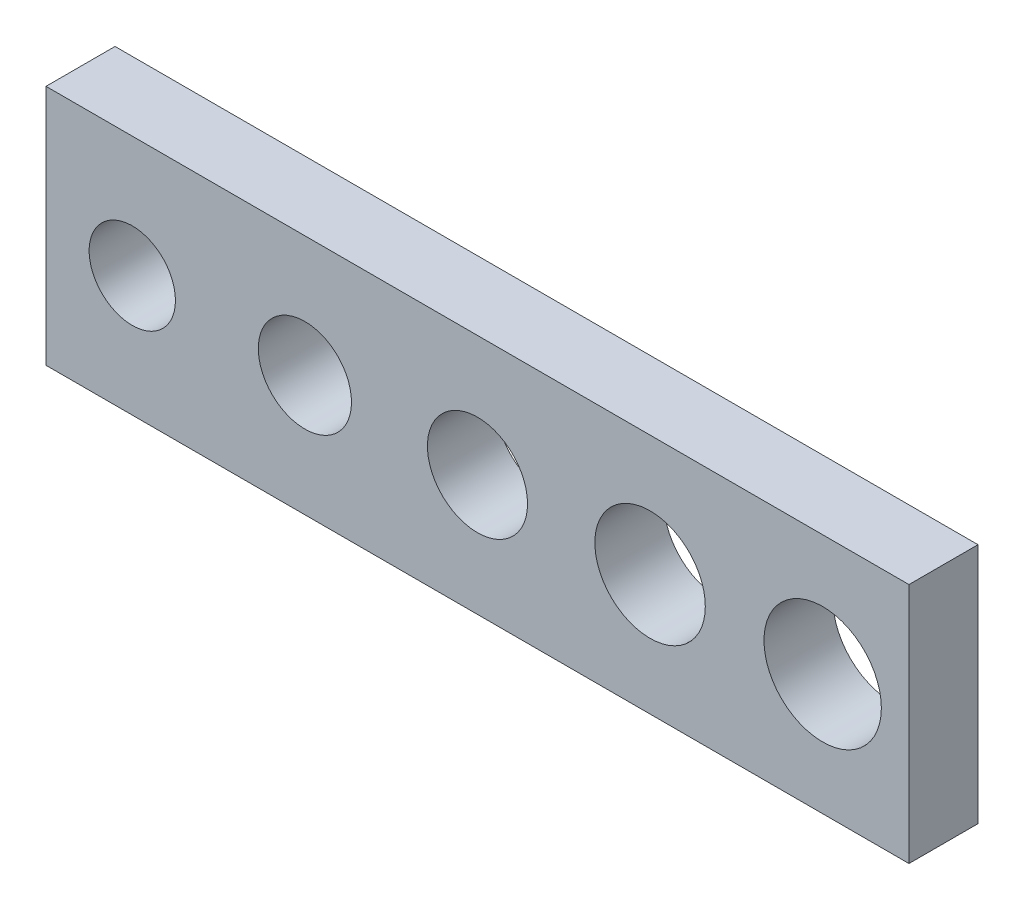
ISO-10303-21;
HEADER;
FILE_DESCRIPTION(('STEP AP214'),'2;1');
FILE_NAME('part.step','',(''),(''),'','','');
FILE_SCHEMA(('AUTOMOTIVE_DESIGN { 1 0 10303 214 1 1 1 1 }'));
ENDSEC;
DATA;
#1=APPLICATION_CONTEXT('core data for automotive mechanical design processes');
#2=APPLICATION_PROTOCOL_DEFINITION('international standard','automotive_design',2000,#1);
#3=PRODUCT_CONTEXT('',#1,'mechanical');
#4=PRODUCT('Part','Part','',(#3));
#5=PRODUCT_RELATED_PRODUCT_CATEGORY('part','',(#4));
#6=PRODUCT_DEFINITION_FORMATION('','',#4);
#7=PRODUCT_DEFINITION_CONTEXT('part definition',#1,'design');
#8=PRODUCT_DEFINITION('design','',#6,#7);
#9=PRODUCT_DEFINITION_SHAPE('','',#8);
#10=(LENGTH_UNIT() NAMED_UNIT(*) SI_UNIT(.MILLI.,.METRE.));
#11=(NAMED_UNIT(*) PLANE_ANGLE_UNIT() SI_UNIT($,.RADIAN.));
#12=(NAMED_UNIT(*) SI_UNIT($,.STERADIAN.) SOLID_ANGLE_UNIT());
#13=UNCERTAINTY_MEASURE_WITH_UNIT(LENGTH_MEASURE(1.E-05),#10,'distance_accuracy_value','');
#14=(GEOMETRIC_REPRESENTATION_CONTEXT(3) GLOBAL_UNCERTAINTY_ASSIGNED_CONTEXT((#13)) GLOBAL_UNIT_ASSIGNED_CONTEXT((#10,
#11,#12)) REPRESENTATION_CONTEXT('',''));
#15=CARTESIAN_POINT('',(0.,0.,0.));
#16=DIRECTION('',(0.,0.,1.));
#17=DIRECTION('',(1.,0.,0.));
#18=AXIS2_PLACEMENT_3D('',#15,#16,#17);
#19=CARTESIAN_POINT('',(0.,0.,5.08));
#20=DIRECTION('',(0.,0.,-1.));
#21=DIRECTION('',(-1.,0.,0.));
#22=AXIS2_PLACEMENT_3D('',#19,#20,#21);
#23=PLANE('',#22);
#24=CARTESIAN_POINT('',(44.45,8.89,5.08));
#25=DIRECTION('',(0.,0.,1.));
#26=DIRECTION('',(1.,0.,0.));
#27=AXIS2_PLACEMENT_3D('',#24,#25,#26);
#28=CIRCLE('',#27,4.06400000000002);
#29=CARTESIAN_POINT('',(48.514,8.89,5.08));
#30=VERTEX_POINT('',#29);
#31=EDGE_CURVE('E127',#30,#30,#28,.T.);
#32=ORIENTED_EDGE('',*,*,#31,.F.);
#33=EDGE_LOOP('',(#32));
#34=FACE_BOUND('',#33,.T.);
#35=CARTESIAN_POINT('',(19.05,8.89,5.08));
#36=DIRECTION('',(0.,0.,1.));
#37=DIRECTION('',(1.,0.,0.));
#38=AXIS2_PLACEMENT_3D('',#35,#36,#37);
#39=CIRCLE('',#38,3.42900000000001);
#40=CARTESIAN_POINT('',(22.479,8.89,5.08));
#41=VERTEX_POINT('',#40);
#42=EDGE_CURVE('E115',#41,#41,#39,.T.);
#43=ORIENTED_EDGE('',*,*,#42,.F.);
#44=EDGE_LOOP('',(#43));
#45=FACE_BOUND('',#44,.T.);
#46=DIRECTION('',(0.,-1.,0.));
#47=VECTOR('',#46,1.);
#48=CARTESIAN_POINT('',(0.,0.,5.08));
#49=LINE('',#48,#47);
#50=CARTESIAN_POINT('',(0.,17.78,5.08));
#51=VERTEX_POINT('',#50);
#52=CARTESIAN_POINT('',(0.,0.,5.08));
#53=VERTEX_POINT('',#52);
#54=EDGE_CURVE('E85',#51,#53,#49,.T.);
#55=ORIENTED_EDGE('',*,*,#54,.T.);
#56=DIRECTION('',(1.,0.,0.));
#57=VECTOR('',#56,1.);
#58=CARTESIAN_POINT('',(0.,0.,5.08));
#59=LINE('',#58,#57);
#60=CARTESIAN_POINT('',(63.5,0.,5.08));
#61=VERTEX_POINT('',#60);
#62=EDGE_CURVE('E80',#53,#61,#59,.T.);
#63=ORIENTED_EDGE('',*,*,#62,.T.);
#64=DIRECTION('',(0.,1.,0.));
#65=VECTOR('',#64,1.);
#66=CARTESIAN_POINT('',(63.5,0.,5.08));
#67=LINE('',#66,#65);
#68=CARTESIAN_POINT('',(63.5,17.78,5.08));
#69=VERTEX_POINT('',#68);
#70=EDGE_CURVE('E83',#61,#69,#67,.T.);
#71=ORIENTED_EDGE('',*,*,#70,.T.);
#72=DIRECTION('',(-1.,0.,0.));
#73=VECTOR('',#72,1.);
#74=CARTESIAN_POINT('',(0.,17.78,5.08));
#75=LINE('',#74,#73);
#76=EDGE_CURVE('E50',#69,#51,#75,.T.);
#77=ORIENTED_EDGE('',*,*,#76,.T.);
#78=EDGE_LOOP('',(#55,#63,#71,#77));
#79=FACE_BOUND('',#78,.T.);
#80=CARTESIAN_POINT('',(6.35,8.89,5.08));
#81=DIRECTION('',(0.,0.,1.));
#82=DIRECTION('',(1.,0.,0.));
#83=AXIS2_PLACEMENT_3D('',#80,#81,#82);
#84=CIRCLE('',#83,3.175);
#85=CARTESIAN_POINT('',(9.525,8.89,5.08));
#86=VERTEX_POINT('',#85);
#87=EDGE_CURVE('E100',#86,#86,#84,.T.);
#88=ORIENTED_EDGE('',*,*,#87,.F.);
#89=EDGE_LOOP('',(#88));
#90=FACE_BOUND('',#89,.T.);
#91=CARTESIAN_POINT('',(31.75,8.89,5.08));
#92=DIRECTION('',(0.,0.,1.));
#93=DIRECTION('',(1.,0.,0.));
#94=AXIS2_PLACEMENT_3D('',#91,#92,#93);
#95=CIRCLE('',#94,3.683);
#96=CARTESIAN_POINT('',(35.433,8.89,5.08));
#97=VERTEX_POINT('',#96);
#98=EDGE_CURVE('E121',#97,#97,#95,.T.);
#99=ORIENTED_EDGE('',*,*,#98,.F.);
#100=EDGE_LOOP('',(#99));
#101=FACE_BOUND('',#100,.T.);
#102=CARTESIAN_POINT('',(57.15,8.89,5.08));
#103=DIRECTION('',(0.,0.,1.));
#104=DIRECTION('',(1.,0.,0.));
#105=AXIS2_PLACEMENT_3D('',#102,#103,#104);
#106=CIRCLE('',#105,4.318);
#107=CARTESIAN_POINT('',(61.468,8.89,5.08));
#108=VERTEX_POINT('',#107);
#109=EDGE_CURVE('E133',#108,#108,#106,.T.);
#110=ORIENTED_EDGE('',*,*,#109,.F.);
#111=EDGE_LOOP('',(#110));
#112=FACE_BOUND('',#111,.T.);
#113=ADVANCED_FACE('F33',(#34,#45,#79,#90,#101,#112),#23,.F.);
#114=CARTESIAN_POINT('',(0.,0.,0.));
#115=DIRECTION('',(0.,0.,-1.));
#116=DIRECTION('',(-1.,0.,0.));
#117=AXIS2_PLACEMENT_3D('',#114,#115,#116);
#118=PLANE('',#117);
#119=CARTESIAN_POINT('',(44.45,8.89,0.));
#120=DIRECTION('',(0.,0.,1.));
#121=DIRECTION('',(1.,0.,0.));
#122=AXIS2_PLACEMENT_3D('',#119,#120,#121);
#123=CIRCLE('',#122,4.06400000000002);
#124=CARTESIAN_POINT('',(48.514,8.89,0.));
#125=VERTEX_POINT('',#124);
#126=EDGE_CURVE('E130',#125,#125,#123,.T.);
#127=ORIENTED_EDGE('',*,*,#126,.T.);
#128=EDGE_LOOP('',(#127));
#129=FACE_BOUND('',#128,.T.);
#130=CARTESIAN_POINT('',(19.05,8.89,0.));
#131=DIRECTION('',(0.,0.,1.));
#132=DIRECTION('',(1.,0.,0.));
#133=AXIS2_PLACEMENT_3D('',#130,#131,#132);
#134=CIRCLE('',#133,3.42900000000001);
#135=CARTESIAN_POINT('',(22.479,8.89,0.));
#136=VERTEX_POINT('',#135);
#137=EDGE_CURVE('E118',#136,#136,#134,.T.);
#138=ORIENTED_EDGE('',*,*,#137,.T.);
#139=EDGE_LOOP('',(#138));
#140=FACE_BOUND('',#139,.T.);
#141=DIRECTION('',(0.,-1.,0.));
#142=VECTOR('',#141,1.);
#143=CARTESIAN_POINT('',(0.,0.,0.));
#144=LINE('',#143,#142);
#145=CARTESIAN_POINT('',(0.,17.78,0.));
#146=VERTEX_POINT('',#145);
#147=CARTESIAN_POINT('',(0.,0.,0.));
#148=VERTEX_POINT('',#147);
#149=EDGE_CURVE('E97',#146,#148,#144,.T.);
#150=ORIENTED_EDGE('',*,*,#149,.F.);
#151=DIRECTION('',(-1.,0.,0.));
#152=VECTOR('',#151,1.);
#153=CARTESIAN_POINT('',(0.,17.78,0.));
#154=LINE('',#153,#152);
#155=CARTESIAN_POINT('',(63.5,17.78,0.));
#156=VERTEX_POINT('',#155);
#157=EDGE_CURVE('E73',#156,#146,#154,.T.);
#158=ORIENTED_EDGE('',*,*,#157,.F.);
#159=DIRECTION('',(0.,1.,0.));
#160=VECTOR('',#159,1.);
#161=CARTESIAN_POINT('',(63.5,0.,0.));
#162=LINE('',#161,#160);
#163=CARTESIAN_POINT('',(63.5,0.,0.));
#164=VERTEX_POINT('',#163);
#165=EDGE_CURVE('E67',#164,#156,#162,.T.);
#166=ORIENTED_EDGE('',*,*,#165,.F.);
#167=DIRECTION('',(1.,0.,0.));
#168=VECTOR('',#167,1.);
#169=CARTESIAN_POINT('',(0.,0.,0.));
#170=LINE('',#169,#168);
#171=EDGE_CURVE('E89',#148,#164,#170,.T.);
#172=ORIENTED_EDGE('',*,*,#171,.F.);
#173=EDGE_LOOP('',(#150,#158,#166,#172));
#174=FACE_BOUND('',#173,.T.);
#175=CARTESIAN_POINT('',(6.35,8.89,0.));
#176=DIRECTION('',(0.,0.,1.));
#177=DIRECTION('',(1.,0.,0.));
#178=AXIS2_PLACEMENT_3D('',#175,#176,#177);
#179=CIRCLE('',#178,3.175);
#180=CARTESIAN_POINT('',(9.525,8.89,0.));
#181=VERTEX_POINT('',#180);
#182=EDGE_CURVE('E112',#181,#181,#179,.T.);
#183=ORIENTED_EDGE('',*,*,#182,.T.);
#184=EDGE_LOOP('',(#183));
#185=FACE_BOUND('',#184,.T.);
#186=CARTESIAN_POINT('',(31.75,8.89,0.));
#187=DIRECTION('',(0.,0.,1.));
#188=DIRECTION('',(1.,0.,0.));
#189=AXIS2_PLACEMENT_3D('',#186,#187,#188);
#190=CIRCLE('',#189,3.683);
#191=CARTESIAN_POINT('',(35.433,8.89,0.));
#192=VERTEX_POINT('',#191);
#193=EDGE_CURVE('E124',#192,#192,#190,.T.);
#194=ORIENTED_EDGE('',*,*,#193,.T.);
#195=EDGE_LOOP('',(#194));
#196=FACE_BOUND('',#195,.T.);
#197=CARTESIAN_POINT('',(57.15,8.89,0.));
#198=DIRECTION('',(0.,0.,1.));
#199=DIRECTION('',(1.,0.,0.));
#200=AXIS2_PLACEMENT_3D('',#197,#198,#199);
#201=CIRCLE('',#200,4.318);
#202=CARTESIAN_POINT('',(61.468,8.89,0.));
#203=VERTEX_POINT('',#202);
#204=EDGE_CURVE('E136',#203,#203,#201,.T.);
#205=ORIENTED_EDGE('',*,*,#204,.T.);
#206=EDGE_LOOP('',(#205));
#207=FACE_BOUND('',#206,.T.);
#208=ADVANCED_FACE('F108',(#129,#140,#174,#185,#196,#207),#118,.T.);
#209=CARTESIAN_POINT('',(0.,0.,5.08));
#210=DIRECTION('',(1.,0.,0.));
#211=DIRECTION('',(0.,1.,0.));
#212=AXIS2_PLACEMENT_3D('',#209,#210,#211);
#213=PLANE('',#212);
#214=ORIENTED_EDGE('',*,*,#149,.T.);
#215=DIRECTION('',(0.,0.,-1.));
#216=VECTOR('',#215,1.);
#217=CARTESIAN_POINT('',(0.,0.,5.08));
#218=LINE('',#217,#216);
#219=EDGE_CURVE('E11',#53,#148,#218,.T.);
#220=ORIENTED_EDGE('',*,*,#219,.F.);
#221=ORIENTED_EDGE('',*,*,#54,.F.);
#222=DIRECTION('',(0.,0.,-1.));
#223=VECTOR('',#222,1.);
#224=CARTESIAN_POINT('',(0.,17.78,5.08));
#225=LINE('',#224,#223);
#226=EDGE_CURVE('E93',#51,#146,#225,.T.);
#227=ORIENTED_EDGE('',*,*,#226,.T.);
#228=EDGE_LOOP('',(#214,#220,#221,#227));
#229=FACE_BOUND('',#228,.T.);
#230=ADVANCED_FACE('F35',(#229),#213,.F.);
#231=CARTESIAN_POINT('',(0.,0.,5.08));
#232=DIRECTION('',(0.,1.,0.));
#233=DIRECTION('',(0.,0.,1.));
#234=AXIS2_PLACEMENT_3D('',#231,#232,#233);
#235=PLANE('',#234);
#236=ORIENTED_EDGE('',*,*,#171,.T.);
#237=DIRECTION('',(0.,0.,-1.));
#238=VECTOR('',#237,1.);
#239=CARTESIAN_POINT('',(63.5,0.,5.08));
#240=LINE('',#239,#238);
#241=EDGE_CURVE('E42',#61,#164,#240,.T.);
#242=ORIENTED_EDGE('',*,*,#241,.F.);
#243=ORIENTED_EDGE('',*,*,#62,.F.);
#244=ORIENTED_EDGE('',*,*,#219,.T.);
#245=EDGE_LOOP('',(#236,#242,#243,#244));
#246=FACE_BOUND('',#245,.T.);
#247=ADVANCED_FACE('F88',(#246),#235,.F.);
#248=CARTESIAN_POINT('',(63.5,0.,5.08));
#249=DIRECTION('',(-1.,0.,0.));
#250=DIRECTION('',(0.,0.,1.));
#251=AXIS2_PLACEMENT_3D('',#248,#249,#250);
#252=PLANE('',#251);
#253=ORIENTED_EDGE('',*,*,#165,.T.);
#254=DIRECTION('',(0.,0.,-1.));
#255=VECTOR('',#254,1.);
#256=CARTESIAN_POINT('',(63.5,17.78,5.08));
#257=LINE('',#256,#255);
#258=EDGE_CURVE('E90',#69,#156,#257,.T.);
#259=ORIENTED_EDGE('',*,*,#258,.F.);
#260=ORIENTED_EDGE('',*,*,#70,.F.);
#261=ORIENTED_EDGE('',*,*,#241,.T.);
#262=EDGE_LOOP('',(#253,#259,#260,#261));
#263=FACE_BOUND('',#262,.T.);
#264=ADVANCED_FACE('F91',(#263),#252,.F.);
#265=CARTESIAN_POINT('',(0.,17.78,5.08));
#266=DIRECTION('',(0.,-1.,0.));
#267=DIRECTION('',(0.,0.,-1.));
#268=AXIS2_PLACEMENT_3D('',#265,#266,#267);
#269=PLANE('',#268);
#270=ORIENTED_EDGE('',*,*,#157,.T.);
#271=ORIENTED_EDGE('',*,*,#226,.F.);
#272=ORIENTED_EDGE('',*,*,#76,.F.);
#273=ORIENTED_EDGE('',*,*,#258,.T.);
#274=EDGE_LOOP('',(#270,#271,#272,#273));
#275=FACE_BOUND('',#274,.T.);
#276=ADVANCED_FACE('F105',(#275),#269,.F.);
#277=CARTESIAN_POINT('',(6.35,8.89,5.08));
#278=DIRECTION('',(0.,0.,-1.));
#279=DIRECTION('',(-1.,0.,0.));
#280=AXIS2_PLACEMENT_3D('',#277,#278,#279);
#281=CYLINDRICAL_SURFACE('',#280,3.175);
#282=ORIENTED_EDGE('',*,*,#87,.T.);
#283=EDGE_LOOP('',(#282));
#284=FACE_BOUND('',#283,.T.);
#285=ORIENTED_EDGE('',*,*,#182,.F.);
#286=EDGE_LOOP('',(#285));
#287=FACE_BOUND('',#286,.T.);
#288=ADVANCED_FACE('F156',(#284,#287),#281,.F.);
#289=CARTESIAN_POINT('',(19.05,8.89,5.08));
#290=DIRECTION('',(0.,0.,-1.));
#291=DIRECTION('',(-1.,0.,0.));
#292=AXIS2_PLACEMENT_3D('',#289,#290,#291);
#293=CYLINDRICAL_SURFACE('',#292,3.42900000000001);
#294=ORIENTED_EDGE('',*,*,#42,.T.);
#295=EDGE_LOOP('',(#294));
#296=FACE_BOUND('',#295,.T.);
#297=ORIENTED_EDGE('',*,*,#137,.F.);
#298=EDGE_LOOP('',(#297));
#299=FACE_BOUND('',#298,.T.);
#300=ADVANCED_FACE('F202',(#296,#299),#293,.F.);
#301=CARTESIAN_POINT('',(31.75,8.89,5.08));
#302=DIRECTION('',(0.,0.,-1.));
#303=DIRECTION('',(-1.,0.,0.));
#304=AXIS2_PLACEMENT_3D('',#301,#302,#303);
#305=CYLINDRICAL_SURFACE('',#304,3.683);
#306=ORIENTED_EDGE('',*,*,#98,.T.);
#307=EDGE_LOOP('',(#306));
#308=FACE_BOUND('',#307,.T.);
#309=ORIENTED_EDGE('',*,*,#193,.F.);
#310=EDGE_LOOP('',(#309));
#311=FACE_BOUND('',#310,.T.);
#312=ADVANCED_FACE('F210',(#308,#311),#305,.F.);
#313=CARTESIAN_POINT('',(44.45,8.89,5.08));
#314=DIRECTION('',(0.,0.,-1.));
#315=DIRECTION('',(-1.,0.,0.));
#316=AXIS2_PLACEMENT_3D('',#313,#314,#315);
#317=CYLINDRICAL_SURFACE('',#316,4.06400000000002);
#318=ORIENTED_EDGE('',*,*,#31,.T.);
#319=EDGE_LOOP('',(#318));
#320=FACE_BOUND('',#319,.T.);
#321=ORIENTED_EDGE('',*,*,#126,.F.);
#322=EDGE_LOOP('',(#321));
#323=FACE_BOUND('',#322,.T.);
#324=ADVANCED_FACE('F218',(#320,#323),#317,.F.);
#325=CARTESIAN_POINT('',(57.15,8.89,5.08));
#326=DIRECTION('',(0.,0.,-1.));
#327=DIRECTION('',(-1.,0.,0.));
#328=AXIS2_PLACEMENT_3D('',#325,#326,#327);
#329=CYLINDRICAL_SURFACE('',#328,4.318);
#330=ORIENTED_EDGE('',*,*,#109,.T.);
#331=EDGE_LOOP('',(#330));
#332=FACE_BOUND('',#331,.T.);
#333=ORIENTED_EDGE('',*,*,#204,.F.);
#334=EDGE_LOOP('',(#333));
#335=FACE_BOUND('',#334,.T.);
#336=ADVANCED_FACE('F142',(#332,#335),#329,.F.);
#337=CLOSED_SHELL('',(#113,#208,#230,#247,#264,#276,#288,#300,#312,#324,#336));
#338=MANIFOLD_SOLID_BREP('B2',#337);
#339=ADVANCED_BREP_SHAPE_REPRESENTATION('',(#18,#338),#14);
#340=SHAPE_DEFINITION_REPRESENTATION(#9,#339);
ENDSEC;
END-ISO-10303-21;
